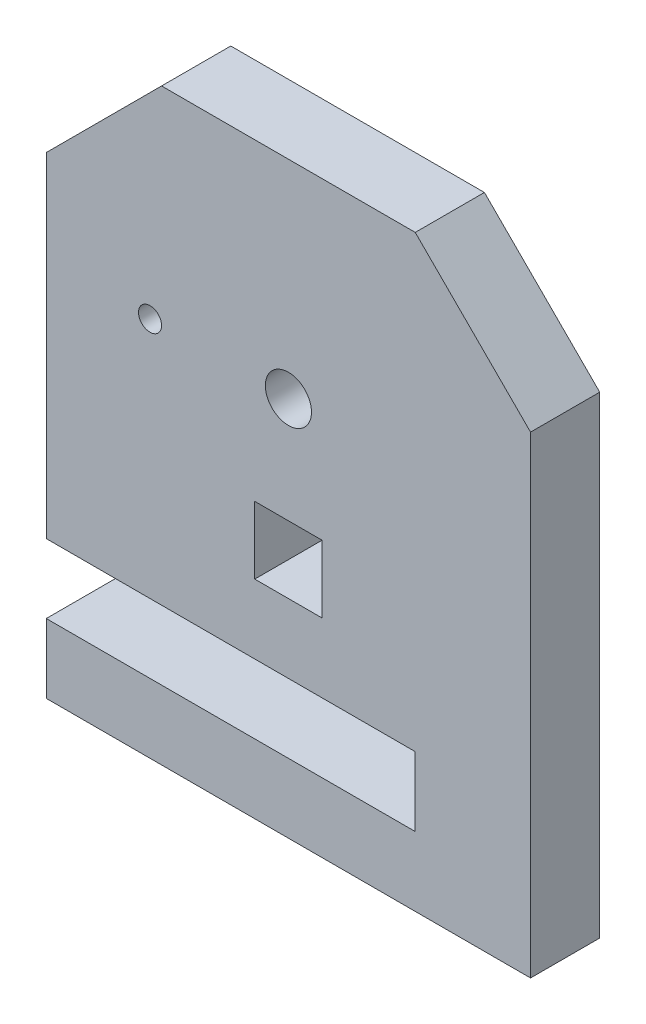
ISO-10303-21;
HEADER;
FILE_DESCRIPTION(('STEP AP214'),'2;1');
FILE_NAME('part.step','',(''),(''),'','','');
FILE_SCHEMA(('AUTOMOTIVE_DESIGN { 1 0 10303 214 1 1 1 1 }'));
ENDSEC;
DATA;
#1=APPLICATION_CONTEXT('core data for automotive mechanical design processes');
#2=APPLICATION_PROTOCOL_DEFINITION('international standard','automotive_design',2000,#1);
#3=PRODUCT_CONTEXT('',#1,'mechanical');
#4=PRODUCT('Part','Part','',(#3));
#5=PRODUCT_RELATED_PRODUCT_CATEGORY('part','',(#4));
#6=PRODUCT_DEFINITION_FORMATION('','',#4);
#7=PRODUCT_DEFINITION_CONTEXT('part definition',#1,'design');
#8=PRODUCT_DEFINITION('design','',#6,#7);
#9=PRODUCT_DEFINITION_SHAPE('','',#8);
#10=(LENGTH_UNIT() NAMED_UNIT(*) SI_UNIT(.MILLI.,.METRE.));
#11=(NAMED_UNIT(*) PLANE_ANGLE_UNIT() SI_UNIT($,.RADIAN.));
#12=(NAMED_UNIT(*) SI_UNIT($,.STERADIAN.) SOLID_ANGLE_UNIT());
#13=UNCERTAINTY_MEASURE_WITH_UNIT(LENGTH_MEASURE(1.E-05),#10,'distance_accuracy_value','');
#14=(GEOMETRIC_REPRESENTATION_CONTEXT(3) GLOBAL_UNCERTAINTY_ASSIGNED_CONTEXT((#13)) GLOBAL_UNIT_ASSIGNED_CONTEXT((#10,
#11,#12)) REPRESENTATION_CONTEXT('',''));
#15=CARTESIAN_POINT('',(0.,0.,0.));
#16=DIRECTION('',(0.,0.,1.));
#17=DIRECTION('',(1.,0.,0.));
#18=AXIS2_PLACEMENT_3D('',#15,#16,#17);
#19=CARTESIAN_POINT('',(0.,-10.7902684563758,3.));
#20=DIRECTION('',(0.,1.,0.));
#21=DIRECTION('',(0.,0.,1.));
#22=AXIS2_PLACEMENT_3D('',#19,#20,#21);
#23=PLANE('',#22);
#24=DIRECTION('',(1.,0.,0.));
#25=VECTOR('',#24,1.);
#26=CARTESIAN_POINT('',(0.,-10.7902684563758,0.));
#27=LINE('',#26,#25);
#28=CARTESIAN_POINT('',(-7.45174410038254,-10.7902684563758,0.));
#29=VERTEX_POINT('',#28);
#30=CARTESIAN_POINT('',(8.54825589961746,-10.7902684563758,0.));
#31=VERTEX_POINT('',#30);
#32=EDGE_CURVE('E191',#29,#31,#27,.T.);
#33=ORIENTED_EDGE('',*,*,#32,.F.);
#34=DIRECTION('',(0.,0.,-1.));
#35=VECTOR('',#34,1.);
#36=CARTESIAN_POINT('',(-7.45174410038254,-10.7902684563758,3.));
#37=LINE('',#36,#35);
#38=CARTESIAN_POINT('',(-7.45174410038254,-10.7902684563758,3.));
#39=VERTEX_POINT('',#38);
#40=EDGE_CURVE('E11',#39,#29,#37,.T.);
#41=ORIENTED_EDGE('',*,*,#40,.F.);
#42=DIRECTION('',(1.,0.,0.));
#43=VECTOR('',#42,1.);
#44=CARTESIAN_POINT('',(0.,-10.7902684563758,3.));
#45=LINE('',#44,#43);
#46=CARTESIAN_POINT('',(8.54825589961746,-10.7902684563758,3.));
#47=VERTEX_POINT('',#46);
#48=EDGE_CURVE('E322',#39,#47,#45,.T.);
#49=ORIENTED_EDGE('',*,*,#48,.T.);
#50=DIRECTION('',(0.,0.,-1.));
#51=VECTOR('',#50,1.);
#52=CARTESIAN_POINT('',(8.54825589961746,-10.7902684563758,3.));
#53=LINE('',#52,#51);
#54=EDGE_CURVE('E54',#47,#31,#53,.T.);
#55=ORIENTED_EDGE('',*,*,#54,.T.);
#56=EDGE_LOOP('',(#33,#41,#49,#55));
#57=FACE_BOUND('',#56,.T.);
#58=ADVANCED_FACE('F35',(#57),#23,.T.);
#59=CARTESIAN_POINT('',(-7.45174410038256,0.,3.));
#60=DIRECTION('',(1.,0.,0.));
#61=DIRECTION('',(0.,1.,0.));
#62=AXIS2_PLACEMENT_3D('',#59,#60,#61);
#63=PLANE('',#62);
#64=DIRECTION('',(0.,-1.,0.));
#65=VECTOR('',#64,1.);
#66=CARTESIAN_POINT('',(-7.45174410038256,0.,0.));
#67=LINE('',#66,#65);
#68=CARTESIAN_POINT('',(-7.45174410038254,-13.7902684563758,0.));
#69=VERTEX_POINT('',#68);
#70=EDGE_CURVE('E193',#29,#69,#67,.T.);
#71=ORIENTED_EDGE('',*,*,#70,.T.);
#72=DIRECTION('',(0.,0.,-1.));
#73=VECTOR('',#72,1.);
#74=CARTESIAN_POINT('',(-7.45174410038254,-13.7902684563758,3.));
#75=LINE('',#74,#73);
#76=CARTESIAN_POINT('',(-7.45174410038254,-13.7902684563758,3.));
#77=VERTEX_POINT('',#76);
#78=EDGE_CURVE('E45',#77,#69,#75,.T.);
#79=ORIENTED_EDGE('',*,*,#78,.F.);
#80=DIRECTION('',(0.,-1.,0.));
#81=VECTOR('',#80,1.);
#82=CARTESIAN_POINT('',(-7.45174410038256,0.,3.));
#83=LINE('',#82,#81);
#84=EDGE_CURVE('E324',#39,#77,#83,.T.);
#85=ORIENTED_EDGE('',*,*,#84,.F.);
#86=ORIENTED_EDGE('',*,*,#40,.T.);
#87=EDGE_LOOP('',(#71,#79,#85,#86));
#88=FACE_BOUND('',#87,.T.);
#89=ADVANCED_FACE('F264',(#88),#63,.F.);
#90=CARTESIAN_POINT('',(0.,-13.7902684563758,3.));
#91=DIRECTION('',(0.,1.,0.));
#92=DIRECTION('',(-1.,0.,0.));
#93=AXIS2_PLACEMENT_3D('',#90,#91,#92);
#94=PLANE('',#93);
#95=DIRECTION('',(1.,0.,0.));
#96=VECTOR('',#95,1.);
#97=CARTESIAN_POINT('',(0.,-13.7902684563758,0.));
#98=LINE('',#97,#96);
#99=CARTESIAN_POINT('',(13.5482558996175,-13.7902684563758,0.));
#100=VERTEX_POINT('',#99);
#101=EDGE_CURVE('E196',#69,#100,#98,.T.);
#102=ORIENTED_EDGE('',*,*,#101,.T.);
#103=DIRECTION('',(0.,0.,-1.));
#104=VECTOR('',#103,1.);
#105=CARTESIAN_POINT('',(13.5482558996175,-13.7902684563758,3.));
#106=LINE('',#105,#104);
#107=CARTESIAN_POINT('',(13.5482558996175,-13.7902684563758,3.));
#108=VERTEX_POINT('',#107);
#109=EDGE_CURVE('E227',#108,#100,#106,.T.);
#110=ORIENTED_EDGE('',*,*,#109,.F.);
#111=DIRECTION('',(1.,0.,0.));
#112=VECTOR('',#111,1.);
#113=CARTESIAN_POINT('',(0.,-13.7902684563758,3.));
#114=LINE('',#113,#112);
#115=EDGE_CURVE('E327',#77,#108,#114,.T.);
#116=ORIENTED_EDGE('',*,*,#115,.F.);
#117=ORIENTED_EDGE('',*,*,#78,.T.);
#118=EDGE_LOOP('',(#102,#110,#116,#117));
#119=FACE_BOUND('',#118,.T.);
#120=ADVANCED_FACE('F269',(#119),#94,.F.);
#121=CARTESIAN_POINT('',(13.5482558996175,0.,3.));
#122=DIRECTION('',(1.,0.,0.));
#123=DIRECTION('',(0.,1.,0.));
#124=AXIS2_PLACEMENT_3D('',#121,#122,#123);
#125=PLANE('',#124);
#126=DIRECTION('',(0.,-1.,0.));
#127=VECTOR('',#126,1.);
#128=CARTESIAN_POINT('',(13.5482558996175,0.,0.));
#129=LINE('',#128,#127);
#130=CARTESIAN_POINT('',(13.5482558996175,6.70973154362416,0.));
#131=VERTEX_POINT('',#130);
#132=EDGE_CURVE('E199',#131,#100,#129,.T.);
#133=ORIENTED_EDGE('',*,*,#132,.F.);
#134=DIRECTION('',(0.,0.,-1.));
#135=VECTOR('',#134,1.);
#136=CARTESIAN_POINT('',(13.5482558996175,6.70973154362416,3.));
#137=LINE('',#136,#135);
#138=CARTESIAN_POINT('',(13.5482558996175,6.70973154362416,3.));
#139=VERTEX_POINT('',#138);
#140=EDGE_CURVE('E225',#139,#131,#137,.T.);
#141=ORIENTED_EDGE('',*,*,#140,.F.);
#142=DIRECTION('',(0.,-1.,0.));
#143=VECTOR('',#142,1.);
#144=CARTESIAN_POINT('',(13.5482558996175,0.,3.));
#145=LINE('',#144,#143);
#146=EDGE_CURVE('E329',#139,#108,#145,.T.);
#147=ORIENTED_EDGE('',*,*,#146,.T.);
#148=ORIENTED_EDGE('',*,*,#109,.T.);
#149=EDGE_LOOP('',(#133,#141,#147,#148));
#150=FACE_BOUND('',#149,.T.);
#151=ADVANCED_FACE('F275',(#150),#125,.T.);
#152=CARTESIAN_POINT('',(10.1289937216208,10.1289937216208,3.));
#153=DIRECTION('',(0.707106781186547,0.707106781186548,0.));
#154=DIRECTION('',(-0.707106781186548,0.707106781186547,0.));
#155=AXIS2_PLACEMENT_3D('',#152,#153,#154);
#156=PLANE('',#155);
#157=DIRECTION('',(0.707106781186548,-0.707106781186547,0.));
#158=VECTOR('',#157,1.);
#159=CARTESIAN_POINT('',(10.1289937216208,10.1289937216208,0.));
#160=LINE('',#159,#158);
#161=CARTESIAN_POINT('',(8.54825589961746,11.7097315436242,0.));
#162=VERTEX_POINT('',#161);
#163=EDGE_CURVE('E202',#162,#131,#160,.T.);
#164=ORIENTED_EDGE('',*,*,#163,.F.);
#165=DIRECTION('',(0.,0.,-1.));
#166=VECTOR('',#165,1.);
#167=CARTESIAN_POINT('',(8.54825589961746,11.7097315436242,3.));
#168=LINE('',#167,#166);
#169=CARTESIAN_POINT('',(8.54825589961746,11.7097315436242,3.));
#170=VERTEX_POINT('',#169);
#171=EDGE_CURVE('E223',#170,#162,#168,.T.);
#172=ORIENTED_EDGE('',*,*,#171,.F.);
#173=DIRECTION('',(0.707106781186548,-0.707106781186547,0.));
#174=VECTOR('',#173,1.);
#175=CARTESIAN_POINT('',(10.1289937216208,10.1289937216208,3.));
#176=LINE('',#175,#174);
#177=EDGE_CURVE('E332',#170,#139,#176,.T.);
#178=ORIENTED_EDGE('',*,*,#177,.T.);
#179=ORIENTED_EDGE('',*,*,#140,.T.);
#180=EDGE_LOOP('',(#164,#172,#178,#179));
#181=FACE_BOUND('',#180,.T.);
#182=ADVANCED_FACE('F279',(#181),#156,.T.);
#183=CARTESIAN_POINT('',(0.,11.7097315436242,3.));
#184=DIRECTION('',(0.,1.,0.));
#185=DIRECTION('',(-1.,0.,0.));
#186=AXIS2_PLACEMENT_3D('',#183,#184,#185);
#187=PLANE('',#186);
#188=DIRECTION('',(1.,0.,0.));
#189=VECTOR('',#188,1.);
#190=CARTESIAN_POINT('',(0.,11.7097315436242,0.));
#191=LINE('',#190,#189);
#192=CARTESIAN_POINT('',(-2.45174410038254,11.7097315436242,0.));
#193=VERTEX_POINT('',#192);
#194=EDGE_CURVE('E205',#193,#162,#191,.T.);
#195=ORIENTED_EDGE('',*,*,#194,.F.);
#196=DIRECTION('',(0.,0.,-1.));
#197=VECTOR('',#196,1.);
#198=CARTESIAN_POINT('',(-2.45174410038254,11.7097315436242,3.));
#199=LINE('',#198,#197);
#200=CARTESIAN_POINT('',(-2.45174410038254,11.7097315436242,3.));
#201=VERTEX_POINT('',#200);
#202=EDGE_CURVE('E221',#201,#193,#199,.T.);
#203=ORIENTED_EDGE('',*,*,#202,.F.);
#204=DIRECTION('',(1.,0.,0.));
#205=VECTOR('',#204,1.);
#206=CARTESIAN_POINT('',(0.,11.7097315436242,3.));
#207=LINE('',#206,#205);
#208=EDGE_CURVE('E335',#201,#170,#207,.T.);
#209=ORIENTED_EDGE('',*,*,#208,.T.);
#210=ORIENTED_EDGE('',*,*,#171,.T.);
#211=EDGE_LOOP('',(#195,#203,#209,#210));
#212=FACE_BOUND('',#211,.T.);
#213=ADVANCED_FACE('F283',(#212),#187,.T.);
#214=CARTESIAN_POINT('',(-7.08073782200335,7.08073782200335,3.));
#215=DIRECTION('',(0.707106781186547,-0.707106781186547,0.));
#216=DIRECTION('',(0.707106781186548,0.707106781186548,0.));
#217=AXIS2_PLACEMENT_3D('',#214,#215,#216);
#218=PLANE('',#217);
#219=DIRECTION('',(-0.707106781186548,-0.707106781186548,0.));
#220=VECTOR('',#219,1.);
#221=CARTESIAN_POINT('',(-7.08073782200335,7.08073782200335,0.));
#222=LINE('',#221,#220);
#223=CARTESIAN_POINT('',(-7.45174410038254,6.70973154362416,0.));
#224=VERTEX_POINT('',#223);
#225=EDGE_CURVE('E208',#193,#224,#222,.T.);
#226=ORIENTED_EDGE('',*,*,#225,.T.);
#227=DIRECTION('',(0.,0.,-1.));
#228=VECTOR('',#227,1.);
#229=CARTESIAN_POINT('',(-7.45174410038254,6.70973154362416,3.));
#230=LINE('',#229,#228);
#231=CARTESIAN_POINT('',(-7.45174410038254,6.70973154362416,3.));
#232=VERTEX_POINT('',#231);
#233=EDGE_CURVE('E164',#232,#224,#230,.T.);
#234=ORIENTED_EDGE('',*,*,#233,.F.);
#235=DIRECTION('',(-0.707106781186548,-0.707106781186548,0.));
#236=VECTOR('',#235,1.);
#237=CARTESIAN_POINT('',(-7.08073782200335,7.08073782200335,3.));
#238=LINE('',#237,#236);
#239=EDGE_CURVE('E153',#201,#232,#238,.T.);
#240=ORIENTED_EDGE('',*,*,#239,.F.);
#241=ORIENTED_EDGE('',*,*,#202,.T.);
#242=EDGE_LOOP('',(#226,#234,#240,#241));
#243=FACE_BOUND('',#242,.T.);
#244=ADVANCED_FACE('F287',(#243),#218,.F.);
#245=CARTESIAN_POINT('',(-7.45174410038254,0.,3.));
#246=DIRECTION('',(1.,0.,0.));
#247=DIRECTION('',(0.,0.,-1.));
#248=AXIS2_PLACEMENT_3D('',#245,#246,#247);
#249=PLANE('',#248);
#250=DIRECTION('',(0.,-1.,0.));
#251=VECTOR('',#250,1.);
#252=CARTESIAN_POINT('',(-7.45174410038254,0.,0.));
#253=LINE('',#252,#251);
#254=CARTESIAN_POINT('',(-7.45174410038254,-7.79026845637585,0.));
#255=VERTEX_POINT('',#254);
#256=EDGE_CURVE('E161',#224,#255,#253,.T.);
#257=ORIENTED_EDGE('',*,*,#256,.T.);
#258=DIRECTION('',(0.,0.,-1.));
#259=VECTOR('',#258,1.);
#260=CARTESIAN_POINT('',(-7.45174410038254,-7.79026845637585,3.));
#261=LINE('',#260,#259);
#262=CARTESIAN_POINT('',(-7.45174410038254,-7.79026845637585,3.));
#263=VERTEX_POINT('',#262);
#264=EDGE_CURVE('E159',#263,#255,#261,.T.);
#265=ORIENTED_EDGE('',*,*,#264,.F.);
#266=DIRECTION('',(0.,-1.,0.));
#267=VECTOR('',#266,1.);
#268=CARTESIAN_POINT('',(-7.45174410038254,0.,3.));
#269=LINE('',#268,#267);
#270=EDGE_CURVE('E144',#232,#263,#269,.T.);
#271=ORIENTED_EDGE('',*,*,#270,.F.);
#272=ORIENTED_EDGE('',*,*,#233,.T.);
#273=EDGE_LOOP('',(#257,#265,#271,#272));
#274=FACE_BOUND('',#273,.T.);
#275=ADVANCED_FACE('F160',(#274),#249,.F.);
#276=CARTESIAN_POINT('',(0.,-7.79026845637585,3.));
#277=DIRECTION('',(0.,-1.,0.));
#278=DIRECTION('',(0.,0.,-1.));
#279=AXIS2_PLACEMENT_3D('',#276,#277,#278);
#280=PLANE('',#279);
#281=DIRECTION('',(-1.,0.,0.));
#282=VECTOR('',#281,1.);
#283=CARTESIAN_POINT('',(0.,-7.79026845637585,0.));
#284=LINE('',#283,#282);
#285=CARTESIAN_POINT('',(8.54825589961746,-7.79026845637585,0.));
#286=VERTEX_POINT('',#285);
#287=EDGE_CURVE('E212',#286,#255,#284,.T.);
#288=ORIENTED_EDGE('',*,*,#287,.F.);
#289=DIRECTION('',(0.,0.,-1.));
#290=VECTOR('',#289,1.);
#291=CARTESIAN_POINT('',(8.54825589961746,-7.79026845637585,3.));
#292=LINE('',#291,#290);
#293=CARTESIAN_POINT('',(8.54825589961746,-7.79026845637585,3.));
#294=VERTEX_POINT('',#293);
#295=EDGE_CURVE('E97',#294,#286,#292,.T.);
#296=ORIENTED_EDGE('',*,*,#295,.F.);
#297=DIRECTION('',(-1.,0.,0.));
#298=VECTOR('',#297,1.);
#299=CARTESIAN_POINT('',(0.,-7.79026845637585,3.));
#300=LINE('',#299,#298);
#301=EDGE_CURVE('E150',#294,#263,#300,.T.);
#302=ORIENTED_EDGE('',*,*,#301,.T.);
#303=ORIENTED_EDGE('',*,*,#264,.T.);
#304=EDGE_LOOP('',(#288,#296,#302,#303));
#305=FACE_BOUND('',#304,.T.);
#306=ADVANCED_FACE('F166',(#305),#280,.T.);
#307=CARTESIAN_POINT('',(0.,-1.87026845637584,3.));
#308=DIRECTION('',(0.,1.,0.));
#309=DIRECTION('',(-1.,0.,0.));
#310=AXIS2_PLACEMENT_3D('',#307,#308,#309);
#311=PLANE('',#310);
#312=DIRECTION('',(1.,0.,0.));
#313=VECTOR('',#312,1.);
#314=CARTESIAN_POINT('',(0.,-1.87026845637584,0.));
#315=LINE('',#314,#313);
#316=CARTESIAN_POINT('',(1.58825589961746,-1.87026845637584,0.));
#317=VERTEX_POINT('',#316);
#318=CARTESIAN_POINT('',(4.50825589961746,-1.87026845637584,0.));
#319=VERTEX_POINT('',#318);
#320=EDGE_CURVE('E179',#317,#319,#315,.T.);
#321=ORIENTED_EDGE('',*,*,#320,.T.);
#322=DIRECTION('',(0.,0.,-1.));
#323=VECTOR('',#322,1.);
#324=CARTESIAN_POINT('',(4.50825589961746,-1.87026845637584,3.));
#325=LINE('',#324,#323);
#326=CARTESIAN_POINT('',(4.50825589961746,-1.87026845637584,3.));
#327=VERTEX_POINT('',#326);
#328=EDGE_CURVE('E39',#327,#319,#325,.T.);
#329=ORIENTED_EDGE('',*,*,#328,.F.);
#330=DIRECTION('',(1.,0.,0.));
#331=VECTOR('',#330,1.);
#332=CARTESIAN_POINT('',(0.,-1.87026845637584,3.));
#333=LINE('',#332,#331);
#334=CARTESIAN_POINT('',(1.58825589961746,-1.87026845637584,3.));
#335=VERTEX_POINT('',#334);
#336=EDGE_CURVE('E313',#335,#327,#333,.T.);
#337=ORIENTED_EDGE('',*,*,#336,.F.);
#338=DIRECTION('',(0.,0.,-1.));
#339=VECTOR('',#338,1.);
#340=CARTESIAN_POINT('',(1.58825589961746,-1.87026845637584,3.));
#341=LINE('',#340,#339);
#342=EDGE_CURVE('E169',#335,#317,#341,.T.);
#343=ORIENTED_EDGE('',*,*,#342,.T.);
#344=EDGE_LOOP('',(#321,#329,#337,#343));
#345=FACE_BOUND('',#344,.T.);
#346=ADVANCED_FACE('F242',(#345),#311,.F.);
#347=CARTESIAN_POINT('',(4.50825589961746,0.,3.));
#348=DIRECTION('',(1.,0.,0.));
#349=DIRECTION('',(0.,0.,-1.));
#350=AXIS2_PLACEMENT_3D('',#347,#348,#349);
#351=PLANE('',#350);
#352=DIRECTION('',(0.,-1.,0.));
#353=VECTOR('',#352,1.);
#354=CARTESIAN_POINT('',(4.50825589961746,0.,0.));
#355=LINE('',#354,#353);
#356=CARTESIAN_POINT('',(4.50825589961746,-4.79026845637584,0.));
#357=VERTEX_POINT('',#356);
#358=EDGE_CURVE('E182',#319,#357,#355,.T.);
#359=ORIENTED_EDGE('',*,*,#358,.T.);
#360=DIRECTION('',(0.,0.,-1.));
#361=VECTOR('',#360,1.);
#362=CARTESIAN_POINT('',(4.50825589961746,-4.79026845637584,3.));
#363=LINE('',#362,#361);
#364=CARTESIAN_POINT('',(4.50825589961746,-4.79026845637584,3.));
#365=VERTEX_POINT('',#364);
#366=EDGE_CURVE('E233',#365,#357,#363,.T.);
#367=ORIENTED_EDGE('',*,*,#366,.F.);
#368=DIRECTION('',(0.,-1.,0.));
#369=VECTOR('',#368,1.);
#370=CARTESIAN_POINT('',(4.50825589961746,0.,3.));
#371=LINE('',#370,#369);
#372=EDGE_CURVE('E110',#327,#365,#371,.T.);
#373=ORIENTED_EDGE('',*,*,#372,.F.);
#374=ORIENTED_EDGE('',*,*,#328,.T.);
#375=EDGE_LOOP('',(#359,#367,#373,#374));
#376=FACE_BOUND('',#375,.T.);
#377=ADVANCED_FACE('F238',(#376),#351,.F.);
#378=CARTESIAN_POINT('',(0.,-4.79026845637584,3.));
#379=DIRECTION('',(0.,1.,0.));
#380=DIRECTION('',(-1.,0.,0.));
#381=AXIS2_PLACEMENT_3D('',#378,#379,#380);
#382=PLANE('',#381);
#383=DIRECTION('',(1.,0.,0.));
#384=VECTOR('',#383,1.);
#385=CARTESIAN_POINT('',(0.,-4.79026845637584,0.));
#386=LINE('',#385,#384);
#387=CARTESIAN_POINT('',(1.58825589961746,-4.79026845637584,0.));
#388=VERTEX_POINT('',#387);
#389=EDGE_CURVE('E185',#388,#357,#386,.T.);
#390=ORIENTED_EDGE('',*,*,#389,.F.);
#391=DIRECTION('',(0.,0.,-1.));
#392=VECTOR('',#391,1.);
#393=CARTESIAN_POINT('',(1.58825589961746,-4.79026845637584,3.));
#394=LINE('',#393,#392);
#395=CARTESIAN_POINT('',(1.58825589961746,-4.79026845637584,3.));
#396=VERTEX_POINT('',#395);
#397=EDGE_CURVE('E232',#396,#388,#394,.T.);
#398=ORIENTED_EDGE('',*,*,#397,.F.);
#399=DIRECTION('',(1.,0.,0.));
#400=VECTOR('',#399,1.);
#401=CARTESIAN_POINT('',(0.,-4.79026845637584,3.));
#402=LINE('',#401,#400);
#403=EDGE_CURVE('E315',#396,#365,#402,.T.);
#404=ORIENTED_EDGE('',*,*,#403,.T.);
#405=ORIENTED_EDGE('',*,*,#366,.T.);
#406=EDGE_LOOP('',(#390,#398,#404,#405));
#407=FACE_BOUND('',#406,.T.);
#408=ADVANCED_FACE('F253',(#407),#382,.T.);
#409=CARTESIAN_POINT('',(1.58825589961746,0.,3.));
#410=DIRECTION('',(1.,0.,0.));
#411=DIRECTION('',(0.,1.,0.));
#412=AXIS2_PLACEMENT_3D('',#409,#410,#411);
#413=PLANE('',#412);
#414=DIRECTION('',(0.,-1.,0.));
#415=VECTOR('',#414,1.);
#416=CARTESIAN_POINT('',(1.58825589961746,0.,0.));
#417=LINE('',#416,#415);
#418=EDGE_CURVE('E188',#317,#388,#417,.T.);
#419=ORIENTED_EDGE('',*,*,#418,.F.);
#420=ORIENTED_EDGE('',*,*,#342,.F.);
#421=DIRECTION('',(0.,-1.,0.));
#422=VECTOR('',#421,1.);
#423=CARTESIAN_POINT('',(1.58825589961746,0.,3.));
#424=LINE('',#423,#422);
#425=EDGE_CURVE('E251',#335,#396,#424,.T.);
#426=ORIENTED_EDGE('',*,*,#425,.T.);
#427=ORIENTED_EDGE('',*,*,#397,.T.);
#428=EDGE_LOOP('',(#419,#420,#426,#427));
#429=FACE_BOUND('',#428,.T.);
#430=ADVANCED_FACE('F248',(#429),#413,.T.);
#431=CARTESIAN_POINT('',(3.04825589961744,2.70973154362416,3.));
#432=DIRECTION('',(0.,0.,-1.));
#433=DIRECTION('',(-1.,0.,0.));
#434=AXIS2_PLACEMENT_3D('',#431,#432,#433);
#435=CYLINDRICAL_SURFACE('',#434,1.);
#436=CARTESIAN_POINT('',(3.04825589961744,2.70973154362416,3.));
#437=DIRECTION('',(0.,0.,1.));
#438=DIRECTION('',(1.,0.,0.));
#439=AXIS2_PLACEMENT_3D('',#436,#437,#438);
#440=CIRCLE('',#439,1.);
#441=CARTESIAN_POINT('',(4.04825589961744,2.70973154362416,3.));
#442=VERTEX_POINT('',#441);
#443=EDGE_CURVE('E312',#442,#442,#440,.T.);
#444=ORIENTED_EDGE('',*,*,#443,.T.);
#445=EDGE_LOOP('',(#444));
#446=FACE_BOUND('',#445,.T.);
#447=CARTESIAN_POINT('',(3.04825589961744,2.70973154362416,0.));
#448=DIRECTION('',(0.,0.,1.));
#449=DIRECTION('',(1.,0.,0.));
#450=AXIS2_PLACEMENT_3D('',#447,#448,#449);
#451=CIRCLE('',#450,1.);
#452=CARTESIAN_POINT('',(4.04825589961744,2.70973154362416,0.));
#453=VERTEX_POINT('',#452);
#454=EDGE_CURVE('E176',#453,#453,#451,.T.);
#455=ORIENTED_EDGE('',*,*,#454,.F.);
#456=EDGE_LOOP('',(#455));
#457=FACE_BOUND('',#456,.T.);
#458=ADVANCED_FACE('F260',(#446,#457),#435,.F.);
#459=CARTESIAN_POINT('',(-2.95174410038256,2.70973154362416,3.));
#460=DIRECTION('',(0.,0.,-1.));
#461=DIRECTION('',(-1.,0.,0.));
#462=AXIS2_PLACEMENT_3D('',#459,#460,#461);
#463=CYLINDRICAL_SURFACE('',#462,0.5);
#464=CARTESIAN_POINT('',(-2.95174410038256,2.70973154362416,3.));
#465=DIRECTION('',(0.,0.,1.));
#466=DIRECTION('',(1.,0.,0.));
#467=AXIS2_PLACEMENT_3D('',#464,#465,#466);
#468=CIRCLE('',#467,0.5);
#469=CARTESIAN_POINT('',(-2.45174410038256,2.70973154362416,3.));
#470=VERTEX_POINT('',#469);
#471=EDGE_CURVE('E217',#470,#470,#468,.T.);
#472=ORIENTED_EDGE('',*,*,#471,.T.);
#473=EDGE_LOOP('',(#472));
#474=FACE_BOUND('',#473,.T.);
#475=CARTESIAN_POINT('',(-2.95174410038256,2.70973154362416,0.));
#476=DIRECTION('',(0.,0.,1.));
#477=DIRECTION('',(1.,0.,0.));
#478=AXIS2_PLACEMENT_3D('',#475,#476,#477);
#479=CIRCLE('',#478,0.5);
#480=CARTESIAN_POINT('',(-2.45174410038256,2.70973154362416,0.));
#481=VERTEX_POINT('',#480);
#482=EDGE_CURVE('E173',#481,#481,#479,.T.);
#483=ORIENTED_EDGE('',*,*,#482,.F.);
#484=EDGE_LOOP('',(#483));
#485=FACE_BOUND('',#484,.T.);
#486=ADVANCED_FACE('F37',(#474,#485),#463,.F.);
#487=CARTESIAN_POINT('',(8.54825589961746,0.,3.));
#488=DIRECTION('',(-1.,0.,0.));
#489=DIRECTION('',(0.,0.,1.));
#490=AXIS2_PLACEMENT_3D('',#487,#488,#489);
#491=PLANE('',#490);
#492=DIRECTION('',(0.,1.,0.));
#493=VECTOR('',#492,1.);
#494=CARTESIAN_POINT('',(8.54825589961746,0.,0.));
#495=LINE('',#494,#493);
#496=EDGE_CURVE('E214',#31,#286,#495,.T.);
#497=ORIENTED_EDGE('',*,*,#496,.F.);
#498=ORIENTED_EDGE('',*,*,#54,.F.);
#499=DIRECTION('',(0.,1.,0.));
#500=VECTOR('',#499,1.);
#501=CARTESIAN_POINT('',(8.54825589961746,0.,3.));
#502=LINE('',#501,#500);
#503=EDGE_CURVE('E167',#47,#294,#502,.T.);
#504=ORIENTED_EDGE('',*,*,#503,.T.);
#505=ORIENTED_EDGE('',*,*,#295,.T.);
#506=EDGE_LOOP('',(#497,#498,#504,#505));
#507=FACE_BOUND('',#506,.T.);
#508=ADVANCED_FACE('F296',(#507),#491,.T.);
#509=CARTESIAN_POINT('',(0.,0.,3.));
#510=DIRECTION('',(0.,0.,1.));
#511=DIRECTION('',(1.,0.,0.));
#512=AXIS2_PLACEMENT_3D('',#509,#510,#511);
#513=PLANE('',#512);
#514=ORIENTED_EDGE('',*,*,#471,.F.);
#515=EDGE_LOOP('',(#514));
#516=FACE_BOUND('',#515,.T.);
#517=ORIENTED_EDGE('',*,*,#443,.F.);
#518=EDGE_LOOP('',(#517));
#519=FACE_BOUND('',#518,.T.);
#520=ORIENTED_EDGE('',*,*,#336,.T.);
#521=ORIENTED_EDGE('',*,*,#372,.T.);
#522=ORIENTED_EDGE('',*,*,#403,.F.);
#523=ORIENTED_EDGE('',*,*,#425,.F.);
#524=EDGE_LOOP('',(#520,#521,#522,#523));
#525=FACE_BOUND('',#524,.T.);
#526=ORIENTED_EDGE('',*,*,#48,.F.);
#527=ORIENTED_EDGE('',*,*,#84,.T.);
#528=ORIENTED_EDGE('',*,*,#115,.T.);
#529=ORIENTED_EDGE('',*,*,#146,.F.);
#530=ORIENTED_EDGE('',*,*,#177,.F.);
#531=ORIENTED_EDGE('',*,*,#208,.F.);
#532=ORIENTED_EDGE('',*,*,#239,.T.);
#533=ORIENTED_EDGE('',*,*,#270,.T.);
#534=ORIENTED_EDGE('',*,*,#301,.F.);
#535=ORIENTED_EDGE('',*,*,#503,.F.);
#536=EDGE_LOOP('',(#526,#527,#528,#529,#530,#531,#532,#533,#534,#535));
#537=FACE_BOUND('',#536,.T.);
#538=ADVANCED_FACE('F147',(#516,#519,#525,#537),#513,.T.);
#539=CARTESIAN_POINT('',(0.,0.,0.));
#540=DIRECTION('',(0.,0.,1.));
#541=DIRECTION('',(1.,0.,0.));
#542=AXIS2_PLACEMENT_3D('',#539,#540,#541);
#543=PLANE('',#542);
#544=ORIENTED_EDGE('',*,*,#482,.T.);
#545=EDGE_LOOP('',(#544));
#546=FACE_BOUND('',#545,.T.);
#547=ORIENTED_EDGE('',*,*,#454,.T.);
#548=EDGE_LOOP('',(#547));
#549=FACE_BOUND('',#548,.T.);
#550=ORIENTED_EDGE('',*,*,#320,.F.);
#551=ORIENTED_EDGE('',*,*,#418,.T.);
#552=ORIENTED_EDGE('',*,*,#389,.T.);
#553=ORIENTED_EDGE('',*,*,#358,.F.);
#554=EDGE_LOOP('',(#550,#551,#552,#553));
#555=FACE_BOUND('',#554,.T.);
#556=ORIENTED_EDGE('',*,*,#32,.T.);
#557=ORIENTED_EDGE('',*,*,#496,.T.);
#558=ORIENTED_EDGE('',*,*,#287,.T.);
#559=ORIENTED_EDGE('',*,*,#256,.F.);
#560=ORIENTED_EDGE('',*,*,#225,.F.);
#561=ORIENTED_EDGE('',*,*,#194,.T.);
#562=ORIENTED_EDGE('',*,*,#163,.T.);
#563=ORIENTED_EDGE('',*,*,#132,.T.);
#564=ORIENTED_EDGE('',*,*,#101,.F.);
#565=ORIENTED_EDGE('',*,*,#70,.F.);
#566=EDGE_LOOP('',(#556,#557,#558,#559,#560,#561,#562,#563,#564,#565));
#567=FACE_BOUND('',#566,.T.);
#568=ADVANCED_FACE('F245',(#546,#549,#555,#567),#543,.F.);
#569=CLOSED_SHELL('',(#58,#89,#120,#151,#182,#213,#244,#275,#306,#346,#377,#408,#430,#458,#486,
#508,#538,#568));
#570=MANIFOLD_SOLID_BREP('B2',#569);
#571=ADVANCED_BREP_SHAPE_REPRESENTATION('',(#18,#570),#14);
#572=SHAPE_DEFINITION_REPRESENTATION(#9,#571);
ENDSEC;
END-ISO-10303-21;
